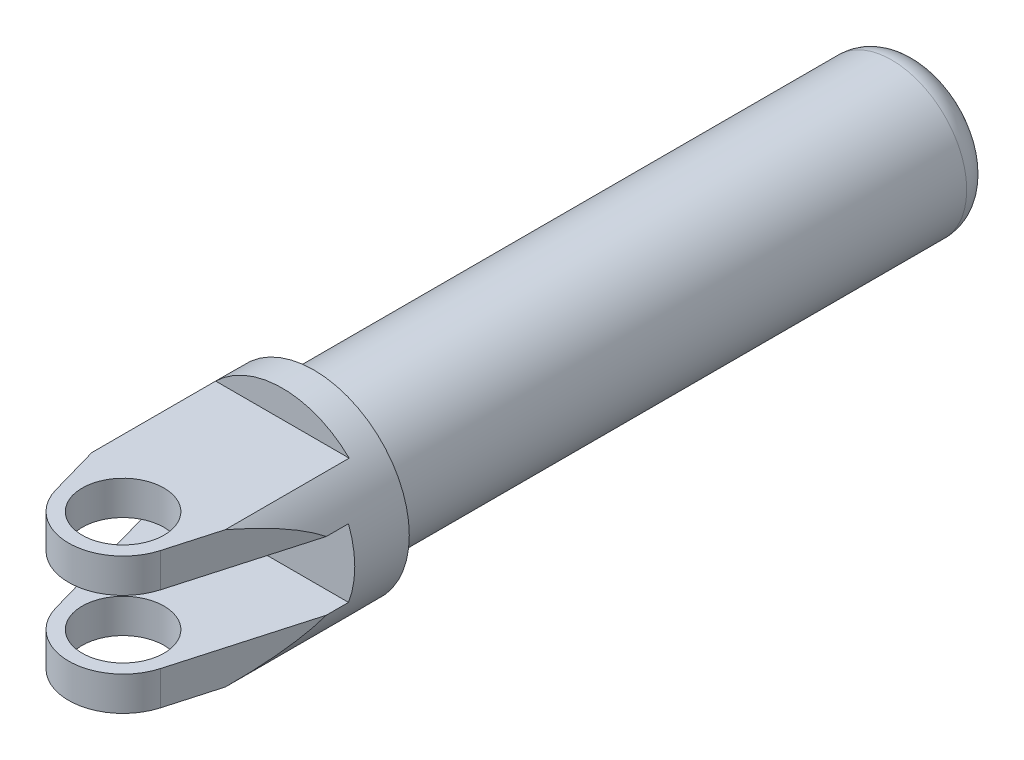
ISO-10303-21;
HEADER;
FILE_DESCRIPTION(('STEP AP214'),'2;1');
FILE_NAME('part.step','',(''),(''),'','','');
FILE_SCHEMA(('AUTOMOTIVE_DESIGN { 1 0 10303 214 1 1 1 1 }'));
ENDSEC;
DATA;
#1=APPLICATION_CONTEXT('core data for automotive mechanical design processes');
#2=APPLICATION_PROTOCOL_DEFINITION('international standard','automotive_design',2000,#1);
#3=PRODUCT_CONTEXT('',#1,'mechanical');
#4=PRODUCT('Part','Part','',(#3));
#5=PRODUCT_RELATED_PRODUCT_CATEGORY('part','',(#4));
#6=PRODUCT_DEFINITION_FORMATION('','',#4);
#7=PRODUCT_DEFINITION_CONTEXT('part definition',#1,'design');
#8=PRODUCT_DEFINITION('design','',#6,#7);
#9=PRODUCT_DEFINITION_SHAPE('','',#8);
#10=(LENGTH_UNIT() NAMED_UNIT(*) SI_UNIT(.MILLI.,.METRE.));
#11=(NAMED_UNIT(*) PLANE_ANGLE_UNIT() SI_UNIT($,.RADIAN.));
#12=(NAMED_UNIT(*) SI_UNIT($,.STERADIAN.) SOLID_ANGLE_UNIT());
#13=UNCERTAINTY_MEASURE_WITH_UNIT(LENGTH_MEASURE(1.E-05),#10,'distance_accuracy_value','');
#14=(GEOMETRIC_REPRESENTATION_CONTEXT(3) GLOBAL_UNCERTAINTY_ASSIGNED_CONTEXT((#13)) GLOBAL_UNIT_ASSIGNED_CONTEXT((#10,
#11,#12)) REPRESENTATION_CONTEXT('',''));
#15=CARTESIAN_POINT('',(0.,0.,0.));
#16=DIRECTION('',(0.,0.,1.));
#17=DIRECTION('',(1.,0.,0.));
#18=AXIS2_PLACEMENT_3D('',#15,#16,#17);
#19=CARTESIAN_POINT('',(-3.5,3.501,2.));
#20=DIRECTION('',(0.961916952662469,0.,-0.273341866863729));
#21=DIRECTION('',(-0.273341866863729,0.,-0.96191695266247));
#22=AXIS2_PLACEMENT_3D('',#19,#20,#21);
#23=PLANE('',#22);
#24=DIRECTION('',(0.,-1.,0.));
#25=VECTOR('',#24,1.);
#26=CARTESIAN_POINT('',(-1.92383390532494,3.501,7.54668373372746));
#27=LINE('',#26,#25);
#28=CARTESIAN_POINT('',(-1.92383390532494,2.5,7.54668373372746));
#29=VERTEX_POINT('',#28);
#30=CARTESIAN_POINT('',(-1.92383390532494,1.25,7.54668373372746));
#31=VERTEX_POINT('',#30);
#32=EDGE_CURVE('E223',#29,#31,#27,.T.);
#33=ORIENTED_EDGE('',*,*,#32,.F.);
#34=DIRECTION('',(-0.273341866863729,0.,-0.96191695266247));
#35=VECTOR('',#34,1.);
#36=CARTESIAN_POINT('',(-3.5,2.5,2.));
#37=LINE('',#36,#35);
#38=CARTESIAN_POINT('',(-2.44948974278318,2.5,5.69684906654437));
#39=VERTEX_POINT('',#38);
#40=EDGE_CURVE('E176',#29,#39,#37,.T.);
#41=ORIENTED_EDGE('',*,*,#40,.T.);
#42=CARTESIAN_POINT('',(0.,0.,14.3168447371331));
#43=DIRECTION('',(0.961916952662469,0.,-0.273341866863729));
#44=DIRECTION('',(-0.273341866863729,0.,-0.96191695266247));
#45=AXIS2_PLACEMENT_3D('',#42,#43,#44);
#46=ELLIPSE('',#45,12.8044782899829,3.5);
#47=CARTESIAN_POINT('',(-3.2691742076555,1.25,2.81229869875225));
#48=VERTEX_POINT('',#47);
#49=EDGE_CURVE('E148',#39,#48,#46,.F.);
#50=ORIENTED_EDGE('',*,*,#49,.T.);
#51=DIRECTION('',(0.273341866863729,0.,0.96191695266247));
#52=VECTOR('',#51,1.);
#53=CARTESIAN_POINT('',(-3.5,1.25,2.));
#54=LINE('',#53,#52);
#55=EDGE_CURVE('E210',#48,#31,#54,.T.);
#56=ORIENTED_EDGE('',*,*,#55,.T.);
#57=EDGE_LOOP('',(#33,#41,#50,#56));
#58=FACE_BOUND('',#57,.T.);
#59=ADVANCED_FACE('F32',(#58),#23,.F.);
#60=CARTESIAN_POINT('',(0.,3.501,7.));
#61=DIRECTION('',(0.,-1.,0.));
#62=DIRECTION('',(0.,0.,-1.));
#63=AXIS2_PLACEMENT_3D('',#60,#61,#62);
#64=CYLINDRICAL_SURFACE('',#63,2.);
#65=DIRECTION('',(0.,-1.,0.));
#66=VECTOR('',#65,1.);
#67=CARTESIAN_POINT('',(1.92383390532494,3.501,7.54668373372746));
#68=LINE('',#67,#66);
#69=CARTESIAN_POINT('',(1.92383390532494,2.5,7.54668373372746));
#70=VERTEX_POINT('',#69);
#71=CARTESIAN_POINT('',(1.92383390532494,1.25,7.54668373372746));
#72=VERTEX_POINT('',#71);
#73=EDGE_CURVE('E227',#70,#72,#68,.T.);
#74=ORIENTED_EDGE('',*,*,#73,.F.);
#75=CARTESIAN_POINT('',(0.,2.5,7.));
#76=DIRECTION('',(0.,-1.,0.));
#77=DIRECTION('',(0.,0.,-1.));
#78=AXIS2_PLACEMENT_3D('',#75,#76,#77);
#79=CIRCLE('',#78,2.);
#80=EDGE_CURVE('E173',#70,#29,#79,.T.);
#81=ORIENTED_EDGE('',*,*,#80,.T.);
#82=ORIENTED_EDGE('',*,*,#32,.T.);
#83=CARTESIAN_POINT('',(0.,1.25,7.));
#84=DIRECTION('',(0.,1.,0.));
#85=DIRECTION('',(0.,0.,1.));
#86=AXIS2_PLACEMENT_3D('',#83,#84,#85);
#87=CIRCLE('',#86,2.);
#88=EDGE_CURVE('E207',#31,#72,#87,.T.);
#89=ORIENTED_EDGE('',*,*,#88,.T.);
#90=EDGE_LOOP('',(#74,#81,#82,#89));
#91=FACE_BOUND('',#90,.T.);
#92=ADVANCED_FACE('F273',(#91),#64,.T.);
#93=CARTESIAN_POINT('',(3.5,3.501,2.));
#94=DIRECTION('',(-0.961916952662469,0.,-0.273341866863729));
#95=DIRECTION('',(-0.273341866863729,0.,0.96191695266247));
#96=AXIS2_PLACEMENT_3D('',#93,#94,#95);
#97=PLANE('',#96);
#98=CARTESIAN_POINT('',(0.,0.,14.3168447371331));
#99=DIRECTION('',(-0.961916952662469,0.,-0.273341866863729));
#100=DIRECTION('',(0.273341866863729,0.,-0.96191695266247));
#101=AXIS2_PLACEMENT_3D('',#98,#99,#100);
#102=ELLIPSE('',#101,12.8044782899829,3.5);
#103=CARTESIAN_POINT('',(3.2691742076555,1.25,2.81229869875225));
#104=VERTEX_POINT('',#103);
#105=CARTESIAN_POINT('',(2.44948974278318,2.5,5.69684906654437));
#106=VERTEX_POINT('',#105);
#107=EDGE_CURVE('E225',#104,#106,#102,.F.);
#108=ORIENTED_EDGE('',*,*,#107,.T.);
#109=DIRECTION('',(-0.273341866863729,0.,0.96191695266247));
#110=VECTOR('',#109,1.);
#111=CARTESIAN_POINT('',(3.5,2.5,2.));
#112=LINE('',#111,#110);
#113=EDGE_CURVE('E47',#106,#70,#112,.T.);
#114=ORIENTED_EDGE('',*,*,#113,.T.);
#115=ORIENTED_EDGE('',*,*,#73,.T.);
#116=DIRECTION('',(0.273341866863729,0.,-0.96191695266247));
#117=VECTOR('',#116,1.);
#118=CARTESIAN_POINT('',(3.5,1.25,2.));
#119=LINE('',#118,#117);
#120=EDGE_CURVE('E204',#72,#104,#119,.T.);
#121=ORIENTED_EDGE('',*,*,#120,.T.);
#122=EDGE_LOOP('',(#108,#114,#115,#121));
#123=FACE_BOUND('',#122,.T.);
#124=ADVANCED_FACE('F269',(#123),#97,.F.);
#125=CARTESIAN_POINT('',(0.,3.501,7.));
#126=DIRECTION('',(0.,-1.,0.));
#127=DIRECTION('',(0.,0.,-1.));
#128=AXIS2_PLACEMENT_3D('',#125,#126,#127);
#129=CYLINDRICAL_SURFACE('',#128,1.5);
#130=CARTESIAN_POINT('',(0.,2.5,7.));
#131=DIRECTION('',(0.,-1.,0.));
#132=DIRECTION('',(0.,0.,-1.));
#133=AXIS2_PLACEMENT_3D('',#130,#131,#132);
#134=CIRCLE('',#133,1.5);
#135=CARTESIAN_POINT('',(0.,2.5,5.5));
#136=VERTEX_POINT('',#135);
#137=EDGE_CURVE('E178',#136,#136,#134,.T.);
#138=CARTESIAN_POINT('',(0.,1.25,7.));
#139=DIRECTION('',(0.,1.,0.));
#140=DIRECTION('',(0.,0.,1.));
#141=AXIS2_PLACEMENT_3D('',#138,#139,#140);
#142=CIRCLE('',#141,1.5);
#143=CARTESIAN_POINT('',(0.,1.25,5.5));
#144=VERTEX_POINT('',#143);
#145=EDGE_CURVE('E203',#144,#144,#142,.T.);
#146=CARTESIAN_POINT('',(0.,2.5,5.5));
#147=CARTESIAN_POINT('',(0.,2.48697916666667,5.5));
#148=CARTESIAN_POINT('',(0.,2.47395833333333,5.5));
#149=CARTESIAN_POINT('',(0.,2.44791666666667,5.5));
#150=CARTESIAN_POINT('',(0.,2.43489583333333,5.5));
#151=CARTESIAN_POINT('',(0.,2.40885416666667,5.5));
#152=CARTESIAN_POINT('',(0.,2.39583333333333,5.5));
#153=CARTESIAN_POINT('',(0.,2.36979166666667,5.5));
#154=CARTESIAN_POINT('',(0.,2.35677083333333,5.5));
#155=CARTESIAN_POINT('',(0.,2.33072916666667,5.5));
#156=CARTESIAN_POINT('',(0.,2.31770833333333,5.5));
#157=CARTESIAN_POINT('',(0.,2.29166666666667,5.5));
#158=CARTESIAN_POINT('',(0.,2.27864583333333,5.5));
#159=CARTESIAN_POINT('',(0.,2.25260416666667,5.5));
#160=CARTESIAN_POINT('',(0.,2.23958333333333,5.5));
#161=CARTESIAN_POINT('',(0.,2.21354166666667,5.5));
#162=CARTESIAN_POINT('',(0.,2.20052083333333,5.5));
#163=CARTESIAN_POINT('',(0.,2.17447916666667,5.5));
#164=CARTESIAN_POINT('',(0.,2.16145833333333,5.5));
#165=CARTESIAN_POINT('',(0.,2.13541666666667,5.5));
#166=CARTESIAN_POINT('',(0.,2.12239583333333,5.5));
#167=CARTESIAN_POINT('',(0.,2.09635416666667,5.5));
#168=CARTESIAN_POINT('',(0.,2.08333333333333,5.5));
#169=CARTESIAN_POINT('',(0.,2.05729166666667,5.5));
#170=CARTESIAN_POINT('',(0.,2.04427083333333,5.5));
#171=CARTESIAN_POINT('',(0.,2.01822916666667,5.5));
#172=CARTESIAN_POINT('',(0.,2.00520833333333,5.5));
#173=CARTESIAN_POINT('',(0.,1.97916666666667,5.5));
#174=CARTESIAN_POINT('',(0.,1.96614583333333,5.5));
#175=CARTESIAN_POINT('',(0.,1.94010416666667,5.5));
#176=CARTESIAN_POINT('',(0.,1.92708333333333,5.5));
#177=CARTESIAN_POINT('',(0.,1.90104166666667,5.5));
#178=CARTESIAN_POINT('',(0.,1.88802083333333,5.5));
#179=CARTESIAN_POINT('',(0.,1.86197916666667,5.5));
#180=CARTESIAN_POINT('',(0.,1.84895833333333,5.5));
#181=CARTESIAN_POINT('',(0.,1.82291666666667,5.5));
#182=CARTESIAN_POINT('',(0.,1.80989583333333,5.5));
#183=CARTESIAN_POINT('',(0.,1.78385416666667,5.5));
#184=CARTESIAN_POINT('',(0.,1.77083333333333,5.5));
#185=CARTESIAN_POINT('',(0.,1.74479166666667,5.5));
#186=CARTESIAN_POINT('',(0.,1.73177083333333,5.5));
#187=CARTESIAN_POINT('',(0.,1.70572916666667,5.5));
#188=CARTESIAN_POINT('',(0.,1.69270833333333,5.5));
#189=CARTESIAN_POINT('',(0.,1.66666666666667,5.5));
#190=CARTESIAN_POINT('',(0.,1.65364583333333,5.5));
#191=CARTESIAN_POINT('',(0.,1.62760416666667,5.5));
#192=CARTESIAN_POINT('',(0.,1.61458333333333,5.5));
#193=CARTESIAN_POINT('',(0.,1.58854166666667,5.5));
#194=CARTESIAN_POINT('',(0.,1.57552083333333,5.5));
#195=CARTESIAN_POINT('',(0.,1.54947916666667,5.5));
#196=CARTESIAN_POINT('',(0.,1.53645833333333,5.5));
#197=CARTESIAN_POINT('',(0.,1.51041666666667,5.5));
#198=CARTESIAN_POINT('',(0.,1.49739583333333,5.5));
#199=CARTESIAN_POINT('',(0.,1.47135416666667,5.5));
#200=CARTESIAN_POINT('',(0.,1.45833333333333,5.5));
#201=CARTESIAN_POINT('',(0.,1.43229166666667,5.5));
#202=CARTESIAN_POINT('',(0.,1.41927083333333,5.5));
#203=CARTESIAN_POINT('',(0.,1.39322916666667,5.5));
#204=CARTESIAN_POINT('',(0.,1.38020833333333,5.5));
#205=CARTESIAN_POINT('',(0.,1.35416666666667,5.5));
#206=CARTESIAN_POINT('',(0.,1.34114583333333,5.5));
#207=CARTESIAN_POINT('',(0.,1.31510416666667,5.5));
#208=CARTESIAN_POINT('',(0.,1.30208333333333,5.5));
#209=CARTESIAN_POINT('',(0.,1.27604166666667,5.5));
#210=CARTESIAN_POINT('',(0.,1.26302083333333,5.5));
#211=CARTESIAN_POINT('',(0.,1.25,5.5));
#212=B_SPLINE_CURVE_WITH_KNOTS('',3,(#146,#147,#148,#149,#150,#151,#152,#153,#154,#155,#156,
#157,#158,#159,#160,#161,#162,#163,#164,#165,#166,#167,#168,#169,#170,#171,#172,#173,#174,#175,
#176,#177,#178,#179,#180,#181,#182,#183,#184,#185,#186,#187,#188,#189,#190,#191,#192,#193,#194,
#195,#196,#197,#198,#199,#200,#201,#202,#203,#204,#205,#206,#207,#208,#209,#210,#211),
.UNSPECIFIED.,.F.,.F.,(4,2,2,2,2,2,2,2,2,2,2,2,2,2,2,2,2,2,2,2,2,2,2,2,2,2,2,2,2,2,2,2,4),(0.,
0.0390625,0.0781250000000001,0.1171875,0.15625,0.1953125,0.234375,0.2734375,0.3125,
0.351562499999999,0.390625,0.4296875,0.46875,0.5078125,0.546875,0.585937499999999,
0.624999999999999,0.6640625,0.703124999999999,0.742187499999999,0.781249999999999,
0.820312499999999,0.859374999999999,0.898437499999999,0.937499999999999,0.976562499999999,
1.015625,1.0546875,1.09375,1.1328125,1.171875,1.2109375,1.25),.UNSPECIFIED.);
#213=EDGE_CURVE('BSEAM303',#136,#144,#212,.T.);
#214=ORIENTED_EDGE('',*,*,#137,.F.);
#215=ORIENTED_EDGE('',*,*,#145,.F.);
#216=ORIENTED_EDGE('',*,*,#213,.T.);
#217=ORIENTED_EDGE('',*,*,#213,.F.);
#218=EDGE_LOOP('',(#214,#216,#215,#217));
#219=FACE_BOUND('',#218,.T.);
#220=ADVANCED_FACE('F303',(#219),#129,.F.);
#221=CARTESIAN_POINT('',(0.,0.,-22.2));
#222=DIRECTION('',(0.,0.,1.));
#223=DIRECTION('',(1.,0.,0.));
#224=AXIS2_PLACEMENT_3D('',#221,#222,#223);
#225=CYLINDRICAL_SURFACE('',#224,2.75);
#226=CARTESIAN_POINT('',(0.,0.,-21.2));
#227=DIRECTION('',(0.,0.,1.));
#228=DIRECTION('',(1.,0.,0.));
#229=AXIS2_PLACEMENT_3D('',#226,#227,#228);
#230=CIRCLE('',#229,2.75);
#231=CARTESIAN_POINT('',(2.75,0.,-21.2));
#232=VERTEX_POINT('',#231);
#233=EDGE_CURVE('E145',#232,#232,#230,.T.);
#234=ORIENTED_EDGE('',*,*,#233,.T.);
#235=EDGE_LOOP('',(#234));
#236=FACE_BOUND('',#235,.T.);
#237=CARTESIAN_POINT('',(0.,0.,0.));
#238=DIRECTION('',(0.,0.,1.));
#239=DIRECTION('',(1.,0.,0.));
#240=AXIS2_PLACEMENT_3D('',#237,#238,#239);
#241=CIRCLE('',#240,2.75);
#242=CARTESIAN_POINT('',(2.75,0.,0.));
#243=VERTEX_POINT('',#242);
#244=EDGE_CURVE('E233',#243,#243,#241,.T.);
#245=ORIENTED_EDGE('',*,*,#244,.F.);
#246=EDGE_LOOP('',(#245));
#247=FACE_BOUND('',#246,.T.);
#248=ADVANCED_FACE('F299',(#236,#247),#225,.T.);
#249=CARTESIAN_POINT('',(0.,0.,-22.2));
#250=DIRECTION('',(0.,0.,1.));
#251=DIRECTION('',(1.,0.,0.));
#252=AXIS2_PLACEMENT_3D('',#249,#250,#251);
#253=PLANE('',#252);
#254=CARTESIAN_POINT('',(0.,0.,-22.2));
#255=DIRECTION('',(0.,0.,1.));
#256=DIRECTION('',(1.,0.,0.));
#257=AXIS2_PLACEMENT_3D('',#254,#255,#256);
#258=CIRCLE('',#257,1.75);
#259=CARTESIAN_POINT('',(1.75,0.,-22.2));
#260=VERTEX_POINT('',#259);
#261=EDGE_CURVE('E141',#260,#260,#258,.F.);
#262=ORIENTED_EDGE('',*,*,#261,.T.);
#263=EDGE_LOOP('',(#262));
#264=FACE_BOUND('',#263,.T.);
#265=ADVANCED_FACE('F302',(#264),#253,.F.);
#266=CARTESIAN_POINT('',(0.,0.,2.));
#267=DIRECTION('',(0.,0.,-1.));
#268=DIRECTION('',(-1.,0.,0.));
#269=AXIS2_PLACEMENT_3D('',#266,#267,#268);
#270=CYLINDRICAL_SURFACE('',#269,3.5);
#271=ORIENTED_EDGE('',*,*,#49,.F.);
#272=DIRECTION('',(0.,0.,-1.));
#273=VECTOR('',#272,1.);
#274=CARTESIAN_POINT('',(-2.44948974278318,2.5,2.));
#275=LINE('',#274,#273);
#276=CARTESIAN_POINT('',(-2.44948974278318,2.5,1.15531627725623));
#277=VERTEX_POINT('',#276);
#278=EDGE_CURVE('E11',#39,#277,#275,.T.);
#279=ORIENTED_EDGE('',*,*,#278,.T.);
#280=CARTESIAN_POINT('',(0.,0.,1.15531627725623));
#281=DIRECTION('',(0.,0.,-1.));
#282=DIRECTION('',(-1.,0.,0.));
#283=AXIS2_PLACEMENT_3D('',#280,#281,#282);
#284=CIRCLE('',#283,3.5);
#285=CARTESIAN_POINT('',(2.44948974278318,2.5,1.15531627725623));
#286=VERTEX_POINT('',#285);
#287=EDGE_CURVE('E40',#277,#286,#284,.T.);
#288=ORIENTED_EDGE('',*,*,#287,.T.);
#289=DIRECTION('',(0.,0.,-1.));
#290=VECTOR('',#289,1.);
#291=CARTESIAN_POINT('',(2.44948974278318,2.5,2.));
#292=LINE('',#291,#290);
#293=EDGE_CURVE('E140',#286,#106,#292,.F.);
#294=ORIENTED_EDGE('',*,*,#293,.T.);
#295=ORIENTED_EDGE('',*,*,#107,.F.);
#296=DIRECTION('',(0.,0.,-1.));
#297=VECTOR('',#296,1.);
#298=CARTESIAN_POINT('',(3.2691742076555,1.25,2.));
#299=LINE('',#298,#297);
#300=CARTESIAN_POINT('',(3.2691742076555,1.25,2.));
#301=VERTEX_POINT('',#300);
#302=EDGE_CURVE('E216',#104,#301,#299,.T.);
#303=ORIENTED_EDGE('',*,*,#302,.T.);
#304=CARTESIAN_POINT('',(0.,0.,2.));
#305=DIRECTION('',(0.,0.,-1.));
#306=DIRECTION('',(0.,1.,0.));
#307=AXIS2_PLACEMENT_3D('',#304,#305,#306);
#308=CIRCLE('',#307,3.5);
#309=CARTESIAN_POINT('',(3.2691742076555,-1.25,2.));
#310=VERTEX_POINT('',#309);
#311=EDGE_CURVE('E220',#301,#310,#308,.T.);
#312=ORIENTED_EDGE('',*,*,#311,.T.);
#313=DIRECTION('',(0.,0.,-1.));
#314=VECTOR('',#313,1.);
#315=CARTESIAN_POINT('',(3.2691742076555,-1.25,2.));
#316=LINE('',#315,#314);
#317=CARTESIAN_POINT('',(3.2691742076555,-1.25,2.81229869875225));
#318=VERTEX_POINT('',#317);
#319=EDGE_CURVE('E197',#310,#318,#316,.F.);
#320=ORIENTED_EDGE('',*,*,#319,.T.);
#321=CARTESIAN_POINT('',(2.44948974278318,-2.5,5.69684906654437));
#322=VERTEX_POINT('',#321);
#323=EDGE_CURVE('E242',#322,#318,#102,.F.);
#324=ORIENTED_EDGE('',*,*,#323,.F.);
#325=DIRECTION('',(0.,0.,-1.));
#326=VECTOR('',#325,1.);
#327=CARTESIAN_POINT('',(2.44948974278318,-2.5,2.));
#328=LINE('',#327,#326);
#329=CARTESIAN_POINT('',(2.44948974278318,-2.5,1.15531627725623));
#330=VERTEX_POINT('',#329);
#331=EDGE_CURVE('E55',#322,#330,#328,.T.);
#332=ORIENTED_EDGE('',*,*,#331,.T.);
#333=CARTESIAN_POINT('',(0.,0.,1.15531627725623));
#334=DIRECTION('',(0.,0.,-1.));
#335=DIRECTION('',(-1.,0.,0.));
#336=AXIS2_PLACEMENT_3D('',#333,#334,#335);
#337=CIRCLE('',#336,3.5);
#338=CARTESIAN_POINT('',(-2.44948974278318,-2.5,1.15531627725623));
#339=VERTEX_POINT('',#338);
#340=EDGE_CURVE('E133',#330,#339,#337,.T.);
#341=ORIENTED_EDGE('',*,*,#340,.T.);
#342=DIRECTION('',(0.,0.,-1.));
#343=VECTOR('',#342,1.);
#344=CARTESIAN_POINT('',(-2.44948974278318,-2.5,2.));
#345=LINE('',#344,#343);
#346=CARTESIAN_POINT('',(-2.44948974278318,-2.5,5.69684906654437));
#347=VERTEX_POINT('',#346);
#348=EDGE_CURVE('E120',#339,#347,#345,.F.);
#349=ORIENTED_EDGE('',*,*,#348,.T.);
#350=CARTESIAN_POINT('',(-3.2691742076555,-1.25,2.81229869875225));
#351=VERTEX_POINT('',#350);
#352=EDGE_CURVE('E222',#351,#347,#46,.F.);
#353=ORIENTED_EDGE('',*,*,#352,.F.);
#354=DIRECTION('',(0.,0.,-1.));
#355=VECTOR('',#354,1.);
#356=CARTESIAN_POINT('',(-3.2691742076555,-1.25,2.));
#357=LINE('',#356,#355);
#358=CARTESIAN_POINT('',(-3.2691742076555,-1.25,2.));
#359=VERTEX_POINT('',#358);
#360=EDGE_CURVE('E200',#351,#359,#357,.T.);
#361=ORIENTED_EDGE('',*,*,#360,.T.);
#362=CARTESIAN_POINT('',(-3.2691742076555,1.25,2.));
#363=VERTEX_POINT('',#362);
#364=EDGE_CURVE('E219',#359,#363,#308,.T.);
#365=ORIENTED_EDGE('',*,*,#364,.T.);
#366=DIRECTION('',(0.,0.,-1.));
#367=VECTOR('',#366,1.);
#368=CARTESIAN_POINT('',(-3.2691742076555,1.25,2.));
#369=LINE('',#368,#367);
#370=EDGE_CURVE('E213',#363,#48,#369,.F.);
#371=ORIENTED_EDGE('',*,*,#370,.T.);
#372=EDGE_LOOP('',(#271,#279,#288,#294,#295,#303,#312,#320,#324,#332,#341,#349,#353,#361,#365,#371));
#373=FACE_BOUND('',#372,.T.);
#374=CARTESIAN_POINT('',(0.,0.,0.));
#375=DIRECTION('',(0.,0.,1.));
#376=DIRECTION('',(1.,0.,0.));
#377=AXIS2_PLACEMENT_3D('',#374,#375,#376);
#378=CIRCLE('',#377,3.5);
#379=CARTESIAN_POINT('',(3.5,0.,0.));
#380=VERTEX_POINT('',#379);
#381=EDGE_CURVE('E229',#380,#380,#378,.T.);
#382=ORIENTED_EDGE('',*,*,#381,.T.);
#383=EDGE_LOOP('',(#382));
#384=FACE_BOUND('',#383,.T.);
#385=ADVANCED_FACE('F137',(#373,#384),#270,.T.);
#386=CARTESIAN_POINT('',(0.,0.,0.));
#387=DIRECTION('',(0.,0.,1.));
#388=DIRECTION('',(1.,0.,0.));
#389=AXIS2_PLACEMENT_3D('',#386,#387,#388);
#390=PLANE('',#389);
#391=ORIENTED_EDGE('',*,*,#244,.T.);
#392=EDGE_LOOP('',(#391));
#393=FACE_BOUND('',#392,.T.);
#394=ORIENTED_EDGE('',*,*,#381,.F.);
#395=EDGE_LOOP('',(#394));
#396=FACE_BOUND('',#395,.T.);
#397=ADVANCED_FACE('F288',(#393,#396),#390,.F.);
#398=CARTESIAN_POINT('',(0.,0.,-21.2));
#399=DIRECTION('',(0.,0.,1.));
#400=DIRECTION('',(1.,0.,0.));
#401=AXIS2_PLACEMENT_3D('',#398,#399,#400);
#402=TOROIDAL_SURFACE('',#401,1.75,1.);
#403=ORIENTED_EDGE('',*,*,#261,.F.);
#404=EDGE_LOOP('',(#403));
#405=FACE_BOUND('',#404,.T.);
#406=ORIENTED_EDGE('',*,*,#233,.F.);
#407=EDGE_LOOP('',(#406));
#408=FACE_BOUND('',#407,.T.);
#409=ADVANCED_FACE('F34',(#405,#408),#402,.T.);
#410=ORIENTED_EDGE('',*,*,#352,.T.);
#411=DIRECTION('',(0.273341866863729,0.,0.96191695266247));
#412=VECTOR('',#411,1.);
#413=CARTESIAN_POINT('',(-3.5,-2.5,2.));
#414=LINE('',#413,#412);
#415=CARTESIAN_POINT('',(-1.92383390532494,-2.5,7.54668373372746));
#416=VERTEX_POINT('',#415);
#417=EDGE_CURVE('E125',#347,#416,#414,.T.);
#418=ORIENTED_EDGE('',*,*,#417,.T.);
#419=CARTESIAN_POINT('',(-1.92383390532494,-1.25,7.54668373372746));
#420=VERTEX_POINT('',#419);
#421=EDGE_CURVE('E226',#420,#416,#27,.T.);
#422=ORIENTED_EDGE('',*,*,#421,.F.);
#423=DIRECTION('',(-0.273341866863729,0.,-0.96191695266247));
#424=VECTOR('',#423,1.);
#425=CARTESIAN_POINT('',(-3.5,-1.25,2.));
#426=LINE('',#425,#424);
#427=EDGE_CURVE('E194',#420,#351,#426,.T.);
#428=ORIENTED_EDGE('',*,*,#427,.T.);
#429=EDGE_LOOP('',(#410,#418,#422,#428));
#430=FACE_BOUND('',#429,.T.);
#431=ADVANCED_FACE('F255',(#430),#23,.F.);
#432=ORIENTED_EDGE('',*,*,#421,.T.);
#433=CARTESIAN_POINT('',(0.,-2.5,7.));
#434=DIRECTION('',(0.,1.,0.));
#435=DIRECTION('',(0.,0.,1.));
#436=AXIS2_PLACEMENT_3D('',#433,#434,#435);
#437=CIRCLE('',#436,2.);
#438=CARTESIAN_POINT('',(1.92383390532494,-2.5,7.54668373372746));
#439=VERTEX_POINT('',#438);
#440=EDGE_CURVE('E167',#416,#439,#437,.T.);
#441=ORIENTED_EDGE('',*,*,#440,.T.);
#442=CARTESIAN_POINT('',(1.92383390532494,-1.25,7.54668373372746));
#443=VERTEX_POINT('',#442);
#444=EDGE_CURVE('E230',#443,#439,#68,.T.);
#445=ORIENTED_EDGE('',*,*,#444,.F.);
#446=CARTESIAN_POINT('',(0.,-1.25,7.));
#447=DIRECTION('',(0.,-1.,0.));
#448=DIRECTION('',(0.,0.,-1.));
#449=AXIS2_PLACEMENT_3D('',#446,#447,#448);
#450=CIRCLE('',#449,2.);
#451=EDGE_CURVE('E191',#443,#420,#450,.T.);
#452=ORIENTED_EDGE('',*,*,#451,.T.);
#453=EDGE_LOOP('',(#432,#441,#445,#452));
#454=FACE_BOUND('',#453,.T.);
#455=ADVANCED_FACE('F252',(#454),#64,.T.);
#456=ORIENTED_EDGE('',*,*,#444,.T.);
#457=DIRECTION('',(0.273341866863729,0.,-0.96191695266247));
#458=VECTOR('',#457,1.);
#459=CARTESIAN_POINT('',(3.5,-2.5,2.));
#460=LINE('',#459,#458);
#461=EDGE_CURVE('E163',#439,#322,#460,.T.);
#462=ORIENTED_EDGE('',*,*,#461,.T.);
#463=ORIENTED_EDGE('',*,*,#323,.T.);
#464=DIRECTION('',(-0.273341866863729,0.,0.96191695266247));
#465=VECTOR('',#464,1.);
#466=CARTESIAN_POINT('',(3.5,-1.25,2.));
#467=LINE('',#466,#465);
#468=EDGE_CURVE('E188',#318,#443,#467,.T.);
#469=ORIENTED_EDGE('',*,*,#468,.T.);
#470=EDGE_LOOP('',(#456,#462,#463,#469));
#471=FACE_BOUND('',#470,.T.);
#472=ADVANCED_FACE('F287',(#471),#97,.F.);
#473=CARTESIAN_POINT('',(0.,-2.5,7.));
#474=DIRECTION('',(0.,1.,0.));
#475=DIRECTION('',(0.,0.,1.));
#476=AXIS2_PLACEMENT_3D('',#473,#474,#475);
#477=CIRCLE('',#476,1.5);
#478=CARTESIAN_POINT('',(0.,-2.5,5.5));
#479=VERTEX_POINT('',#478);
#480=EDGE_CURVE('E160',#479,#479,#477,.T.);
#481=CARTESIAN_POINT('',(0.,-1.25,7.));
#482=DIRECTION('',(0.,-1.,0.));
#483=DIRECTION('',(0.,0.,-1.));
#484=AXIS2_PLACEMENT_3D('',#481,#482,#483);
#485=CIRCLE('',#484,1.5);
#486=CARTESIAN_POINT('',(0.,-1.25,5.5));
#487=VERTEX_POINT('',#486);
#488=EDGE_CURVE('E185',#487,#487,#485,.T.);
#489=CARTESIAN_POINT('',(0.,-2.5,5.5));
#490=CARTESIAN_POINT('',(0.,-2.48697916666667,5.5));
#491=CARTESIAN_POINT('',(0.,-2.47395833333333,5.5));
#492=CARTESIAN_POINT('',(0.,-2.44791666666667,5.5));
#493=CARTESIAN_POINT('',(0.,-2.43489583333333,5.5));
#494=CARTESIAN_POINT('',(0.,-2.40885416666667,5.5));
#495=CARTESIAN_POINT('',(0.,-2.39583333333333,5.5));
#496=CARTESIAN_POINT('',(0.,-2.36979166666667,5.5));
#497=CARTESIAN_POINT('',(0.,-2.35677083333333,5.5));
#498=CARTESIAN_POINT('',(0.,-2.33072916666667,5.5));
#499=CARTESIAN_POINT('',(0.,-2.31770833333333,5.5));
#500=CARTESIAN_POINT('',(0.,-2.29166666666667,5.5));
#501=CARTESIAN_POINT('',(0.,-2.27864583333333,5.5));
#502=CARTESIAN_POINT('',(0.,-2.25260416666667,5.5));
#503=CARTESIAN_POINT('',(0.,-2.23958333333333,5.5));
#504=CARTESIAN_POINT('',(0.,-2.21354166666667,5.5));
#505=CARTESIAN_POINT('',(0.,-2.20052083333333,5.5));
#506=CARTESIAN_POINT('',(0.,-2.17447916666667,5.5));
#507=CARTESIAN_POINT('',(0.,-2.16145833333333,5.5));
#508=CARTESIAN_POINT('',(0.,-2.13541666666667,5.5));
#509=CARTESIAN_POINT('',(0.,-2.12239583333333,5.5));
#510=CARTESIAN_POINT('',(0.,-2.09635416666667,5.5));
#511=CARTESIAN_POINT('',(0.,-2.08333333333333,5.5));
#512=CARTESIAN_POINT('',(0.,-2.05729166666667,5.5));
#513=CARTESIAN_POINT('',(0.,-2.04427083333333,5.5));
#514=CARTESIAN_POINT('',(0.,-2.01822916666667,5.5));
#515=CARTESIAN_POINT('',(0.,-2.00520833333333,5.5));
#516=CARTESIAN_POINT('',(0.,-1.97916666666667,5.5));
#517=CARTESIAN_POINT('',(0.,-1.96614583333333,5.5));
#518=CARTESIAN_POINT('',(0.,-1.94010416666667,5.5));
#519=CARTESIAN_POINT('',(0.,-1.92708333333333,5.5));
#520=CARTESIAN_POINT('',(0.,-1.90104166666667,5.5));
#521=CARTESIAN_POINT('',(0.,-1.88802083333333,5.5));
#522=CARTESIAN_POINT('',(0.,-1.86197916666667,5.5));
#523=CARTESIAN_POINT('',(0.,-1.84895833333333,5.5));
#524=CARTESIAN_POINT('',(0.,-1.82291666666667,5.5));
#525=CARTESIAN_POINT('',(0.,-1.80989583333333,5.5));
#526=CARTESIAN_POINT('',(0.,-1.78385416666667,5.5));
#527=CARTESIAN_POINT('',(0.,-1.77083333333333,5.5));
#528=CARTESIAN_POINT('',(0.,-1.74479166666667,5.5));
#529=CARTESIAN_POINT('',(0.,-1.73177083333333,5.5));
#530=CARTESIAN_POINT('',(0.,-1.70572916666667,5.5));
#531=CARTESIAN_POINT('',(0.,-1.69270833333333,5.5));
#532=CARTESIAN_POINT('',(0.,-1.66666666666667,5.5));
#533=CARTESIAN_POINT('',(0.,-1.65364583333333,5.5));
#534=CARTESIAN_POINT('',(0.,-1.62760416666667,5.5));
#535=CARTESIAN_POINT('',(0.,-1.61458333333333,5.5));
#536=CARTESIAN_POINT('',(0.,-1.58854166666667,5.5));
#537=CARTESIAN_POINT('',(0.,-1.57552083333333,5.5));
#538=CARTESIAN_POINT('',(0.,-1.54947916666667,5.5));
#539=CARTESIAN_POINT('',(0.,-1.53645833333333,5.5));
#540=CARTESIAN_POINT('',(0.,-1.51041666666667,5.5));
#541=CARTESIAN_POINT('',(0.,-1.49739583333333,5.5));
#542=CARTESIAN_POINT('',(0.,-1.47135416666667,5.5));
#543=CARTESIAN_POINT('',(0.,-1.45833333333333,5.5));
#544=CARTESIAN_POINT('',(0.,-1.43229166666667,5.5));
#545=CARTESIAN_POINT('',(0.,-1.41927083333333,5.5));
#546=CARTESIAN_POINT('',(0.,-1.39322916666667,5.5));
#547=CARTESIAN_POINT('',(0.,-1.38020833333333,5.5));
#548=CARTESIAN_POINT('',(0.,-1.35416666666667,5.5));
#549=CARTESIAN_POINT('',(0.,-1.34114583333333,5.5));
#550=CARTESIAN_POINT('',(0.,-1.31510416666667,5.5));
#551=CARTESIAN_POINT('',(0.,-1.30208333333333,5.5));
#552=CARTESIAN_POINT('',(0.,-1.27604166666667,5.5));
#553=CARTESIAN_POINT('',(0.,-1.26302083333333,5.5));
#554=CARTESIAN_POINT('',(0.,-1.25,5.5));
#555=B_SPLINE_CURVE_WITH_KNOTS('',3,(#489,#490,#491,#492,#493,#494,#495,#496,#497,#498,#499,
#500,#501,#502,#503,#504,#505,#506,#507,#508,#509,#510,#511,#512,#513,#514,#515,#516,#517,#518,
#519,#520,#521,#522,#523,#524,#525,#526,#527,#528,#529,#530,#531,#532,#533,#534,#535,#536,#537,
#538,#539,#540,#541,#542,#543,#544,#545,#546,#547,#548,#549,#550,#551,#552,#553,#554),
.UNSPECIFIED.,.F.,.F.,(4,2,2,2,2,2,2,2,2,2,2,2,2,2,2,2,2,2,2,2,2,2,2,2,2,2,2,2,2,2,2,2,4),(0.,
0.0390625,0.0781250000000001,0.1171875,0.15625,0.195312499999999,0.234374999999999,
0.273437499999999,0.312499999999999,0.351562499999999,0.390625,0.4296875,0.468749999999999,
0.507812499999999,0.546874999999999,0.585937499999999,0.624999999999999,0.664062499999999,
0.703124999999999,0.742187499999999,0.781249999999999,0.820312499999998,0.859374999999998,
0.898437499999998,0.937499999999998,0.976562499999998,1.015625,1.0546875,1.09375,1.1328125,
1.171875,1.2109375,1.25),.UNSPECIFIED.);
#556=EDGE_CURVE('BSEAM314',#479,#487,#555,.T.);
#557=ORIENTED_EDGE('',*,*,#480,.F.);
#558=ORIENTED_EDGE('',*,*,#488,.F.);
#559=ORIENTED_EDGE('',*,*,#556,.T.);
#560=ORIENTED_EDGE('',*,*,#556,.F.);
#561=EDGE_LOOP('',(#557,#559,#558,#560));
#562=FACE_BOUND('',#561,.T.);
#563=ADVANCED_FACE('F314',(#562),#129,.F.);
#564=CARTESIAN_POINT('',(-3.5,1.25,2.));
#565=DIRECTION('',(0.,0.,-1.));
#566=DIRECTION('',(0.,1.,0.));
#567=AXIS2_PLACEMENT_3D('',#564,#565,#566);
#568=PLANE('',#567);
#569=DIRECTION('',(1.,0.,0.));
#570=VECTOR('',#569,1.);
#571=CARTESIAN_POINT('',(-3.5,1.25,2.));
#572=LINE('',#571,#570);
#573=EDGE_CURVE('E182',#363,#301,#572,.T.);
#574=ORIENTED_EDGE('',*,*,#573,.F.);
#575=ORIENTED_EDGE('',*,*,#364,.F.);
#576=DIRECTION('',(1.,0.,0.));
#577=VECTOR('',#576,1.);
#578=CARTESIAN_POINT('',(-3.5,-1.25,2.));
#579=LINE('',#578,#577);
#580=EDGE_CURVE('E181',#359,#310,#579,.T.);
#581=ORIENTED_EDGE('',*,*,#580,.T.);
#582=ORIENTED_EDGE('',*,*,#311,.F.);
#583=EDGE_LOOP('',(#574,#575,#581,#582));
#584=FACE_BOUND('',#583,.T.);
#585=ADVANCED_FACE('F264',(#584),#568,.F.);
#586=CARTESIAN_POINT('',(-3.5,1.25,14.3106902320142));
#587=DIRECTION('',(0.,1.,0.));
#588=DIRECTION('',(0.,0.,1.));
#589=AXIS2_PLACEMENT_3D('',#586,#587,#588);
#590=PLANE('',#589);
#591=ORIENTED_EDGE('',*,*,#145,.T.);
#592=EDGE_LOOP('',(#591));
#593=FACE_BOUND('',#592,.T.);
#594=ORIENTED_EDGE('',*,*,#120,.F.);
#595=ORIENTED_EDGE('',*,*,#88,.F.);
#596=ORIENTED_EDGE('',*,*,#55,.F.);
#597=ORIENTED_EDGE('',*,*,#370,.F.);
#598=ORIENTED_EDGE('',*,*,#573,.T.);
#599=ORIENTED_EDGE('',*,*,#302,.F.);
#600=EDGE_LOOP('',(#594,#595,#596,#597,#598,#599));
#601=FACE_BOUND('',#600,.T.);
#602=ADVANCED_FACE('F267',(#593,#601),#590,.F.);
#603=CARTESIAN_POINT('',(-3.5,-1.25,14.3106902320142));
#604=DIRECTION('',(0.,-1.,0.));
#605=DIRECTION('',(0.,0.,-1.));
#606=AXIS2_PLACEMENT_3D('',#603,#604,#605);
#607=PLANE('',#606);
#608=ORIENTED_EDGE('',*,*,#488,.T.);
#609=EDGE_LOOP('',(#608));
#610=FACE_BOUND('',#609,.T.);
#611=ORIENTED_EDGE('',*,*,#427,.F.);
#612=ORIENTED_EDGE('',*,*,#451,.F.);
#613=ORIENTED_EDGE('',*,*,#468,.F.);
#614=ORIENTED_EDGE('',*,*,#319,.F.);
#615=ORIENTED_EDGE('',*,*,#580,.F.);
#616=ORIENTED_EDGE('',*,*,#360,.F.);
#617=EDGE_LOOP('',(#611,#612,#613,#614,#615,#616));
#618=FACE_BOUND('',#617,.T.);
#619=ADVANCED_FACE('F259',(#610,#618),#607,.F.);
#620=CARTESIAN_POINT('',(-3.5,-5.58224108455055,1.15531627725623));
#621=DIRECTION('',(0.,0.,-1.));
#622=DIRECTION('',(-1.,0.,0.));
#623=AXIS2_PLACEMENT_3D('',#620,#621,#622);
#624=PLANE('',#623);
#625=DIRECTION('',(1.,0.,0.));
#626=VECTOR('',#625,1.);
#627=CARTESIAN_POINT('',(-3.5,-2.5,1.15531627725623));
#628=LINE('',#627,#626);
#629=EDGE_CURVE('E123',#339,#330,#628,.T.);
#630=ORIENTED_EDGE('',*,*,#629,.F.);
#631=ORIENTED_EDGE('',*,*,#340,.F.);
#632=EDGE_LOOP('',(#630,#631));
#633=FACE_BOUND('',#632,.T.);
#634=ADVANCED_FACE('F132',(#633),#624,.F.);
#635=CARTESIAN_POINT('',(-3.5,-2.5,12.7220059386341));
#636=DIRECTION('',(0.,1.,0.));
#637=DIRECTION('',(0.,0.,1.));
#638=AXIS2_PLACEMENT_3D('',#635,#636,#637);
#639=PLANE('',#638);
#640=ORIENTED_EDGE('',*,*,#480,.T.);
#641=EDGE_LOOP('',(#640));
#642=FACE_BOUND('',#641,.T.);
#643=ORIENTED_EDGE('',*,*,#461,.F.);
#644=ORIENTED_EDGE('',*,*,#440,.F.);
#645=ORIENTED_EDGE('',*,*,#417,.F.);
#646=ORIENTED_EDGE('',*,*,#348,.F.);
#647=ORIENTED_EDGE('',*,*,#629,.T.);
#648=ORIENTED_EDGE('',*,*,#331,.F.);
#649=EDGE_LOOP('',(#643,#644,#645,#646,#647,#648));
#650=FACE_BOUND('',#649,.T.);
#651=ADVANCED_FACE('F122',(#642,#650),#639,.F.);
#652=CARTESIAN_POINT('',(-3.5,5.58224108455055,1.15531627725623));
#653=DIRECTION('',(0.,0.,-1.));
#654=DIRECTION('',(-1.,0.,0.));
#655=AXIS2_PLACEMENT_3D('',#652,#653,#654);
#656=PLANE('',#655);
#657=DIRECTION('',(1.,0.,0.));
#658=VECTOR('',#657,1.);
#659=CARTESIAN_POINT('',(-3.5,2.5,1.15531627725623));
#660=LINE('',#659,#658);
#661=EDGE_CURVE('E134',#277,#286,#660,.T.);
#662=ORIENTED_EDGE('',*,*,#661,.T.);
#663=ORIENTED_EDGE('',*,*,#287,.F.);
#664=EDGE_LOOP('',(#662,#663));
#665=FACE_BOUND('',#664,.T.);
#666=ADVANCED_FACE('F157',(#665),#656,.F.);
#667=CARTESIAN_POINT('',(-3.5,2.5,12.7220059386341));
#668=DIRECTION('',(0.,-1.,0.));
#669=DIRECTION('',(0.,0.,-1.));
#670=AXIS2_PLACEMENT_3D('',#667,#668,#669);
#671=PLANE('',#670);
#672=ORIENTED_EDGE('',*,*,#137,.T.);
#673=EDGE_LOOP('',(#672));
#674=FACE_BOUND('',#673,.T.);
#675=ORIENTED_EDGE('',*,*,#40,.F.);
#676=ORIENTED_EDGE('',*,*,#80,.F.);
#677=ORIENTED_EDGE('',*,*,#113,.F.);
#678=ORIENTED_EDGE('',*,*,#293,.F.);
#679=ORIENTED_EDGE('',*,*,#661,.F.);
#680=ORIENTED_EDGE('',*,*,#278,.F.);
#681=EDGE_LOOP('',(#675,#676,#677,#678,#679,#680));
#682=FACE_BOUND('',#681,.T.);
#683=ADVANCED_FACE('F158',(#674,#682),#671,.F.);
#684=CLOSED_SHELL('',(#59,#92,#124,#220,#248,#265,#385,#397,#409,#431,#455,#472,#563,#585,#602,
#619,#634,#651,#666,#683));
#685=MANIFOLD_SOLID_BREP('B2',#684);
#686=ADVANCED_BREP_SHAPE_REPRESENTATION('',(#18,#685),#14);
#687=SHAPE_DEFINITION_REPRESENTATION(#9,#686);
ENDSEC;
END-ISO-10303-21;
